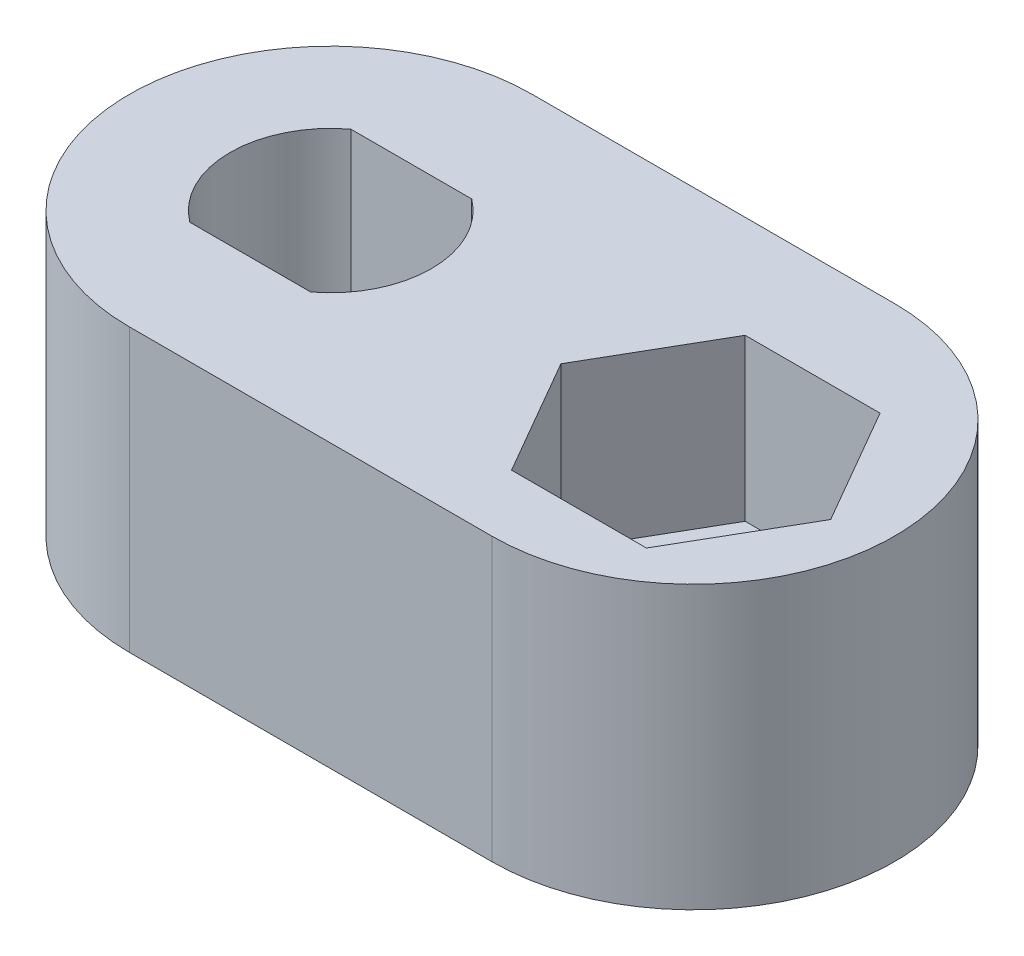
ISO-10303-21;
HEADER;
FILE_DESCRIPTION(('STEP AP214'),'2;1');
FILE_NAME('part.step','',(''),(''),'','','');
FILE_SCHEMA(('AUTOMOTIVE_DESIGN { 1 0 10303 214 1 1 1 1 }'));
ENDSEC;
DATA;
#1=APPLICATION_CONTEXT('core data for automotive mechanical design processes');
#2=APPLICATION_PROTOCOL_DEFINITION('international standard','automotive_design',2000,#1);
#3=PRODUCT_CONTEXT('',#1,'mechanical');
#4=PRODUCT('Part','Part','',(#3));
#5=PRODUCT_RELATED_PRODUCT_CATEGORY('part','',(#4));
#6=PRODUCT_DEFINITION_FORMATION('','',#4);
#7=PRODUCT_DEFINITION_CONTEXT('part definition',#1,'design');
#8=PRODUCT_DEFINITION('design','',#6,#7);
#9=PRODUCT_DEFINITION_SHAPE('','',#8);
#10=(LENGTH_UNIT() NAMED_UNIT(*) SI_UNIT(.MILLI.,.METRE.));
#11=(NAMED_UNIT(*) PLANE_ANGLE_UNIT() SI_UNIT($,.RADIAN.));
#12=(NAMED_UNIT(*) SI_UNIT($,.STERADIAN.) SOLID_ANGLE_UNIT());
#13=UNCERTAINTY_MEASURE_WITH_UNIT(LENGTH_MEASURE(1.E-05),#10,'distance_accuracy_value','');
#14=(GEOMETRIC_REPRESENTATION_CONTEXT(3) GLOBAL_UNCERTAINTY_ASSIGNED_CONTEXT((#13)) GLOBAL_UNIT_ASSIGNED_CONTEXT((#10,
#11,#12)) REPRESENTATION_CONTEXT('',''));
#15=CARTESIAN_POINT('',(0.,0.,0.));
#16=DIRECTION('',(0.,0.,1.));
#17=DIRECTION('',(1.,0.,0.));
#18=AXIS2_PLACEMENT_3D('',#15,#16,#17);
#19=CARTESIAN_POINT('',(5.,7.,0.436816997812618));
#20=DIRECTION('',(0.,1.,0.));
#21=DIRECTION('',(0.,0.,1.));
#22=AXIS2_PLACEMENT_3D('',#19,#20,#21);
#23=CYLINDRICAL_SURFACE('',#22,2.07500000000001);
#24=CARTESIAN_POINT('',(5.,0.,0.436816997812618));
#25=DIRECTION('',(0.,1.,0.));
#26=DIRECTION('',(0.,0.,1.));
#27=AXIS2_PLACEMENT_3D('',#24,#25,#26);
#28=CIRCLE('',#27,2.07500000000001);
#29=CARTESIAN_POINT('',(5.,0.,2.51181699781263));
#30=VERTEX_POINT('',#29);
#31=EDGE_CURVE('E193',#30,#30,#28,.T.);
#32=ORIENTED_EDGE('',*,*,#31,.F.);
#33=EDGE_LOOP('',(#32));
#34=FACE_BOUND('',#33,.T.);
#35=CARTESIAN_POINT('',(5.,3.,0.436816997812618));
#36=DIRECTION('',(0.,1.,0.));
#37=DIRECTION('',(0.,0.,1.));
#38=AXIS2_PLACEMENT_3D('',#35,#36,#37);
#39=CIRCLE('',#38,2.07500000000001);
#40=CARTESIAN_POINT('',(5.,3.,2.51181699781263));
#41=VERTEX_POINT('',#40);
#42=EDGE_CURVE('E39',#41,#41,#39,.F.);
#43=ORIENTED_EDGE('',*,*,#42,.F.);
#44=EDGE_LOOP('',(#43));
#45=FACE_BOUND('',#44,.T.);
#46=ADVANCED_FACE('F35',(#34,#45),#23,.F.);
#47=CARTESIAN_POINT('',(-4.5,7.,0.));
#48=DIRECTION('',(0.,-1.,0.));
#49=DIRECTION('',(0.,0.,-1.));
#50=AXIS2_PLACEMENT_3D('',#47,#48,#49);
#51=CYLINDRICAL_SURFACE('',#50,5.);
#52=CARTESIAN_POINT('',(-4.5,0.,0.));
#53=DIRECTION('',(0.,1.,0.));
#54=DIRECTION('',(0.,0.,1.));
#55=AXIS2_PLACEMENT_3D('',#52,#53,#54);
#56=CIRCLE('',#55,5.);
#57=CARTESIAN_POINT('',(-4.5,0.,-5.));
#58=VERTEX_POINT('',#57);
#59=CARTESIAN_POINT('',(-4.5,0.,5.));
#60=VERTEX_POINT('',#59);
#61=EDGE_CURVE('E223',#58,#60,#56,.T.);
#62=ORIENTED_EDGE('',*,*,#61,.T.);
#63=DIRECTION('',(0.,-1.,0.));
#64=VECTOR('',#63,1.);
#65=CARTESIAN_POINT('',(-4.5,7.,5.));
#66=LINE('',#65,#64);
#67=CARTESIAN_POINT('',(-4.5,7.,5.));
#68=VERTEX_POINT('',#67);
#69=EDGE_CURVE('E11',#68,#60,#66,.T.);
#70=ORIENTED_EDGE('',*,*,#69,.F.);
#71=CARTESIAN_POINT('',(-4.5,7.,0.));
#72=DIRECTION('',(0.,1.,0.));
#73=DIRECTION('',(0.,0.,1.));
#74=AXIS2_PLACEMENT_3D('',#71,#72,#73);
#75=CIRCLE('',#74,5.);
#76=CARTESIAN_POINT('',(-4.5,7.,-5.));
#77=VERTEX_POINT('',#76);
#78=EDGE_CURVE('E229',#77,#68,#75,.T.);
#79=ORIENTED_EDGE('',*,*,#78,.F.);
#80=DIRECTION('',(0.,-1.,0.));
#81=VECTOR('',#80,1.);
#82=CARTESIAN_POINT('',(-4.5,7.,-5.));
#83=LINE('',#82,#81);
#84=EDGE_CURVE('E239',#77,#58,#83,.T.);
#85=ORIENTED_EDGE('',*,*,#84,.T.);
#86=EDGE_LOOP('',(#62,#70,#79,#85));
#87=FACE_BOUND('',#86,.T.);
#88=ADVANCED_FACE('F37',(#87),#51,.T.);
#89=CARTESIAN_POINT('',(-4.5,7.,5.));
#90=DIRECTION('',(0.,0.,-1.));
#91=DIRECTION('',(-1.,0.,0.));
#92=AXIS2_PLACEMENT_3D('',#89,#90,#91);
#93=PLANE('',#92);
#94=DIRECTION('',(1.,0.,0.));
#95=VECTOR('',#94,1.);
#96=CARTESIAN_POINT('',(-4.5,0.,5.));
#97=LINE('',#96,#95);
#98=CARTESIAN_POINT('',(4.5,0.,5.));
#99=VERTEX_POINT('',#98);
#100=EDGE_CURVE('E242',#60,#99,#97,.T.);
#101=ORIENTED_EDGE('',*,*,#100,.T.);
#102=DIRECTION('',(0.,-1.,0.));
#103=VECTOR('',#102,1.);
#104=CARTESIAN_POINT('',(4.5,7.,5.));
#105=LINE('',#104,#103);
#106=CARTESIAN_POINT('',(4.5,7.,5.));
#107=VERTEX_POINT('',#106);
#108=EDGE_CURVE('E44',#107,#99,#105,.T.);
#109=ORIENTED_EDGE('',*,*,#108,.F.);
#110=DIRECTION('',(1.,0.,0.));
#111=VECTOR('',#110,1.);
#112=CARTESIAN_POINT('',(-4.5,7.,5.));
#113=LINE('',#112,#111);
#114=EDGE_CURVE('E232',#68,#107,#113,.T.);
#115=ORIENTED_EDGE('',*,*,#114,.F.);
#116=ORIENTED_EDGE('',*,*,#69,.T.);
#117=EDGE_LOOP('',(#101,#109,#115,#116));
#118=FACE_BOUND('',#117,.T.);
#119=ADVANCED_FACE('F296',(#118),#93,.F.);
#120=CARTESIAN_POINT('',(4.5,7.,0.));
#121=DIRECTION('',(0.,-1.,0.));
#122=DIRECTION('',(0.,0.,-1.));
#123=AXIS2_PLACEMENT_3D('',#120,#121,#122);
#124=CYLINDRICAL_SURFACE('',#123,5.);
#125=CARTESIAN_POINT('',(4.5,0.,0.));
#126=DIRECTION('',(0.,1.,0.));
#127=DIRECTION('',(0.,0.,1.));
#128=AXIS2_PLACEMENT_3D('',#125,#126,#127);
#129=CIRCLE('',#128,5.);
#130=CARTESIAN_POINT('',(4.5,0.,-5.));
#131=VERTEX_POINT('',#130);
#132=EDGE_CURVE('E244',#99,#131,#129,.T.);
#133=ORIENTED_EDGE('',*,*,#132,.T.);
#134=DIRECTION('',(0.,-1.,0.));
#135=VECTOR('',#134,1.);
#136=CARTESIAN_POINT('',(4.5,7.,-5.));
#137=LINE('',#136,#135);
#138=CARTESIAN_POINT('',(4.5,7.,-5.));
#139=VERTEX_POINT('',#138);
#140=EDGE_CURVE('E249',#139,#131,#137,.T.);
#141=ORIENTED_EDGE('',*,*,#140,.F.);
#142=CARTESIAN_POINT('',(4.5,7.,0.));
#143=DIRECTION('',(0.,1.,0.));
#144=DIRECTION('',(0.,0.,1.));
#145=AXIS2_PLACEMENT_3D('',#142,#143,#144);
#146=CIRCLE('',#145,5.);
#147=EDGE_CURVE('E235',#107,#139,#146,.T.);
#148=ORIENTED_EDGE('',*,*,#147,.F.);
#149=ORIENTED_EDGE('',*,*,#108,.T.);
#150=EDGE_LOOP('',(#133,#141,#148,#149));
#151=FACE_BOUND('',#150,.T.);
#152=ADVANCED_FACE('F301',(#151),#124,.T.);
#153=CARTESIAN_POINT('',(-4.5,7.,-5.));
#154=DIRECTION('',(0.,0.,1.));
#155=DIRECTION('',(1.,0.,0.));
#156=AXIS2_PLACEMENT_3D('',#153,#154,#155);
#157=PLANE('',#156);
#158=DIRECTION('',(-1.,0.,0.));
#159=VECTOR('',#158,1.);
#160=CARTESIAN_POINT('',(-4.5,0.,-5.));
#161=LINE('',#160,#159);
#162=EDGE_CURVE('E233',#131,#58,#161,.T.);
#163=ORIENTED_EDGE('',*,*,#162,.T.);
#164=ORIENTED_EDGE('',*,*,#84,.F.);
#165=DIRECTION('',(-1.,0.,0.));
#166=VECTOR('',#165,1.);
#167=CARTESIAN_POINT('',(-4.5,7.,-5.));
#168=LINE('',#167,#166);
#169=EDGE_CURVE('E237',#139,#77,#168,.T.);
#170=ORIENTED_EDGE('',*,*,#169,.F.);
#171=ORIENTED_EDGE('',*,*,#140,.T.);
#172=EDGE_LOOP('',(#163,#164,#170,#171));
#173=FACE_BOUND('',#172,.T.);
#174=ADVANCED_FACE('F285',(#173),#157,.F.);
#175=CARTESIAN_POINT('',(-4.5,7.,0.));
#176=DIRECTION('',(0.,1.,0.));
#177=DIRECTION('',(0.,0.,1.));
#178=AXIS2_PLACEMENT_3D('',#175,#176,#177);
#179=PLANE('',#178);
#180=DIRECTION('',(0.5,0.,-0.866025403784439));
#181=VECTOR('',#180,1.);
#182=CARTESIAN_POINT('',(6.67431578064445,7.,3.33681699781236));
#183=LINE('',#182,#181);
#184=CARTESIAN_POINT('',(6.67431578064445,7.,3.33681699781236));
#185=VERTEX_POINT('',#184);
#186=CARTESIAN_POINT('',(8.34863156129436,7.,0.436816997812368));
#187=VERTEX_POINT('',#186);
#188=EDGE_CURVE('E52',#185,#187,#183,.T.);
#189=ORIENTED_EDGE('',*,*,#188,.F.);
#190=DIRECTION('',(1.,0.,0.));
#191=VECTOR('',#190,1.);
#192=CARTESIAN_POINT('',(3.32568421934462,7.,3.33681699781236));
#193=LINE('',#192,#191);
#194=CARTESIAN_POINT('',(3.32568421934462,7.,3.33681699781236));
#195=VERTEX_POINT('',#194);
#196=EDGE_CURVE('E160',#195,#185,#193,.T.);
#197=ORIENTED_EDGE('',*,*,#196,.F.);
#198=DIRECTION('',(0.5,0.,0.866025403784439));
#199=VECTOR('',#198,1.);
#200=CARTESIAN_POINT('',(1.65136843869471,7.,0.436816997812369));
#201=LINE('',#200,#199);
#202=CARTESIAN_POINT('',(1.65136843869471,7.,0.436816997812369));
#203=VERTEX_POINT('',#202);
#204=EDGE_CURVE('E163',#203,#195,#201,.T.);
#205=ORIENTED_EDGE('',*,*,#204,.F.);
#206=DIRECTION('',(-0.5,0.,0.866025403784439));
#207=VECTOR('',#206,1.);
#208=CARTESIAN_POINT('',(3.32568421934462,7.,-2.46318300218763));
#209=LINE('',#208,#207);
#210=CARTESIAN_POINT('',(3.32568421934462,7.,-2.46318300218763));
#211=VERTEX_POINT('',#210);
#212=EDGE_CURVE('E179',#211,#203,#209,.T.);
#213=ORIENTED_EDGE('',*,*,#212,.F.);
#214=DIRECTION('',(-1.,0.,0.));
#215=VECTOR('',#214,1.);
#216=CARTESIAN_POINT('',(6.67431578064445,7.,-2.46318300218763));
#217=LINE('',#216,#215);
#218=CARTESIAN_POINT('',(6.67431578064445,7.,-2.46318300218763));
#219=VERTEX_POINT('',#218);
#220=EDGE_CURVE('E176',#219,#211,#217,.T.);
#221=ORIENTED_EDGE('',*,*,#220,.F.);
#222=DIRECTION('',(-0.5,0.,-0.866025403784439));
#223=VECTOR('',#222,1.);
#224=CARTESIAN_POINT('',(8.34863156129436,7.,0.436816997812367));
#225=LINE('',#224,#223);
#226=EDGE_CURVE('E174',#187,#219,#225,.T.);
#227=ORIENTED_EDGE('',*,*,#226,.F.);
#228=EDGE_LOOP('',(#189,#197,#205,#213,#221,#227));
#229=FACE_BOUND('',#228,.T.);
#230=CARTESIAN_POINT('',(-4.5,7.,0.));
#231=DIRECTION('',(0.,1.,0.));
#232=DIRECTION('',(0.,0.,1.));
#233=AXIS2_PLACEMENT_3D('',#230,#231,#232);
#234=CIRCLE('',#233,2.5);
#235=CARTESIAN_POINT('',(-6.,7.,-2.));
#236=VERTEX_POINT('',#235);
#237=CARTESIAN_POINT('',(-6.,7.,2.));
#238=VERTEX_POINT('',#237);
#239=EDGE_CURVE('E60',#236,#238,#234,.T.);
#240=ORIENTED_EDGE('',*,*,#239,.F.);
#241=DIRECTION('',(1.,0.,0.));
#242=VECTOR('',#241,1.);
#243=CARTESIAN_POINT('',(0.,7.,-2.));
#244=LINE('',#243,#242);
#245=CARTESIAN_POINT('',(-3.,7.,-2.));
#246=VERTEX_POINT('',#245);
#247=EDGE_CURVE('E207',#236,#246,#244,.T.);
#248=ORIENTED_EDGE('',*,*,#247,.T.);
#249=CARTESIAN_POINT('',(-3.,7.,2.));
#250=VERTEX_POINT('',#249);
#251=EDGE_CURVE('E216',#250,#246,#234,.T.);
#252=ORIENTED_EDGE('',*,*,#251,.F.);
#253=DIRECTION('',(1.,0.,0.));
#254=VECTOR('',#253,1.);
#255=CARTESIAN_POINT('',(0.,7.,2.));
#256=LINE('',#255,#254);
#257=EDGE_CURVE('E215',#238,#250,#256,.T.);
#258=ORIENTED_EDGE('',*,*,#257,.F.);
#259=EDGE_LOOP('',(#240,#248,#252,#258));
#260=FACE_BOUND('',#259,.T.);
#261=ORIENTED_EDGE('',*,*,#78,.T.);
#262=ORIENTED_EDGE('',*,*,#114,.T.);
#263=ORIENTED_EDGE('',*,*,#147,.T.);
#264=ORIENTED_EDGE('',*,*,#169,.T.);
#265=EDGE_LOOP('',(#261,#262,#263,#264));
#266=FACE_BOUND('',#265,.T.);
#267=ADVANCED_FACE('F281',(#229,#260,#266),#179,.T.);
#268=CARTESIAN_POINT('',(-4.5,0.,0.));
#269=DIRECTION('',(0.,1.,0.));
#270=DIRECTION('',(0.,0.,1.));
#271=AXIS2_PLACEMENT_3D('',#268,#269,#270);
#272=PLANE('',#271);
#273=ORIENTED_EDGE('',*,*,#31,.T.);
#274=EDGE_LOOP('',(#273));
#275=FACE_BOUND('',#274,.T.);
#276=CARTESIAN_POINT('',(-4.5,0.,0.));
#277=DIRECTION('',(0.,-1.,0.));
#278=DIRECTION('',(0.,0.,-1.));
#279=AXIS2_PLACEMENT_3D('',#276,#277,#278);
#280=CIRCLE('',#279,3.36);
#281=CARTESIAN_POINT('',(-4.5,0.,-3.36));
#282=VERTEX_POINT('',#281);
#283=EDGE_CURVE('E196',#282,#282,#280,.T.);
#284=ORIENTED_EDGE('',*,*,#283,.F.);
#285=EDGE_LOOP('',(#284));
#286=FACE_BOUND('',#285,.T.);
#287=ORIENTED_EDGE('',*,*,#61,.F.);
#288=ORIENTED_EDGE('',*,*,#162,.F.);
#289=ORIENTED_EDGE('',*,*,#132,.F.);
#290=ORIENTED_EDGE('',*,*,#100,.F.);
#291=EDGE_LOOP('',(#287,#288,#289,#290));
#292=FACE_BOUND('',#291,.T.);
#293=ADVANCED_FACE('F284',(#275,#286,#292),#272,.F.);
#294=CARTESIAN_POINT('',(-4.5,3.,0.));
#295=DIRECTION('',(0.,1.,0.));
#296=DIRECTION('',(0.,0.,1.));
#297=AXIS2_PLACEMENT_3D('',#294,#295,#296);
#298=CYLINDRICAL_SURFACE('',#297,2.5);
#299=ORIENTED_EDGE('',*,*,#239,.T.);
#300=DIRECTION('',(0.,1.,0.));
#301=VECTOR('',#300,1.);
#302=CARTESIAN_POINT('',(-6.,3.,2.));
#303=LINE('',#302,#301);
#304=CARTESIAN_POINT('',(-6.,3.,2.));
#305=VERTEX_POINT('',#304);
#306=EDGE_CURVE('E213',#305,#238,#303,.T.);
#307=ORIENTED_EDGE('',*,*,#306,.F.);
#308=CARTESIAN_POINT('',(-4.5,3.,0.));
#309=DIRECTION('',(0.,1.,0.));
#310=DIRECTION('',(0.,0.,1.));
#311=AXIS2_PLACEMENT_3D('',#308,#309,#310);
#312=CIRCLE('',#311,2.5);
#313=CARTESIAN_POINT('',(-6.,3.,-2.));
#314=VERTEX_POINT('',#313);
#315=EDGE_CURVE('E203',#314,#305,#312,.T.);
#316=ORIENTED_EDGE('',*,*,#315,.F.);
#317=DIRECTION('',(0.,1.,0.));
#318=VECTOR('',#317,1.);
#319=CARTESIAN_POINT('',(-6.,3.,-2.));
#320=LINE('',#319,#318);
#321=EDGE_CURVE('E221',#314,#236,#320,.T.);
#322=ORIENTED_EDGE('',*,*,#321,.T.);
#323=EDGE_LOOP('',(#299,#307,#316,#322));
#324=FACE_BOUND('',#323,.T.);
#325=ADVANCED_FACE('F268',(#324),#298,.F.);
#326=CARTESIAN_POINT('',(0.,3.,-2.));
#327=DIRECTION('',(0.,0.,1.));
#328=DIRECTION('',(1.,0.,0.));
#329=AXIS2_PLACEMENT_3D('',#326,#327,#328);
#330=PLANE('',#329);
#331=ORIENTED_EDGE('',*,*,#247,.F.);
#332=ORIENTED_EDGE('',*,*,#321,.F.);
#333=DIRECTION('',(1.,0.,0.));
#334=VECTOR('',#333,1.);
#335=CARTESIAN_POINT('',(0.,3.,-2.));
#336=LINE('',#335,#334);
#337=CARTESIAN_POINT('',(-3.,3.,-2.));
#338=VERTEX_POINT('',#337);
#339=EDGE_CURVE('E211',#314,#338,#336,.T.);
#340=ORIENTED_EDGE('',*,*,#339,.T.);
#341=DIRECTION('',(0.,1.,0.));
#342=VECTOR('',#341,1.);
#343=CARTESIAN_POINT('',(-3.,3.,-2.));
#344=LINE('',#343,#342);
#345=EDGE_CURVE('E224',#338,#246,#344,.T.);
#346=ORIENTED_EDGE('',*,*,#345,.T.);
#347=EDGE_LOOP('',(#331,#332,#340,#346));
#348=FACE_BOUND('',#347,.T.);
#349=ADVANCED_FACE('F279',(#348),#330,.T.);
#350=ORIENTED_EDGE('',*,*,#251,.T.);
#351=ORIENTED_EDGE('',*,*,#345,.F.);
#352=CARTESIAN_POINT('',(-3.,3.,2.));
#353=VERTEX_POINT('',#352);
#354=EDGE_CURVE('E208',#353,#338,#312,.T.);
#355=ORIENTED_EDGE('',*,*,#354,.F.);
#356=DIRECTION('',(0.,1.,0.));
#357=VECTOR('',#356,1.);
#358=CARTESIAN_POINT('',(-3.,3.,2.));
#359=LINE('',#358,#357);
#360=EDGE_CURVE('E226',#353,#250,#359,.T.);
#361=ORIENTED_EDGE('',*,*,#360,.T.);
#362=EDGE_LOOP('',(#350,#351,#355,#361));
#363=FACE_BOUND('',#362,.T.);
#364=ADVANCED_FACE('F277',(#363),#298,.F.);
#365=CARTESIAN_POINT('',(0.,3.,2.));
#366=DIRECTION('',(0.,0.,1.));
#367=DIRECTION('',(1.,0.,0.));
#368=AXIS2_PLACEMENT_3D('',#365,#366,#367);
#369=PLANE('',#368);
#370=ORIENTED_EDGE('',*,*,#257,.T.);
#371=ORIENTED_EDGE('',*,*,#360,.F.);
#372=DIRECTION('',(1.,0.,0.));
#373=VECTOR('',#372,1.);
#374=CARTESIAN_POINT('',(0.,3.,2.));
#375=LINE('',#374,#373);
#376=EDGE_CURVE('E206',#305,#353,#375,.T.);
#377=ORIENTED_EDGE('',*,*,#376,.F.);
#378=ORIENTED_EDGE('',*,*,#306,.T.);
#379=EDGE_LOOP('',(#370,#371,#377,#378));
#380=FACE_BOUND('',#379,.T.);
#381=ADVANCED_FACE('F262',(#380),#369,.F.);
#382=CARTESIAN_POINT('',(0.,3.,0.));
#383=DIRECTION('',(0.,1.,0.));
#384=DIRECTION('',(0.,0.,1.));
#385=AXIS2_PLACEMENT_3D('',#382,#383,#384);
#386=PLANE('',#385);
#387=CARTESIAN_POINT('',(-4.5,3.,0.));
#388=DIRECTION('',(0.,1.,0.));
#389=DIRECTION('',(0.,0.,1.));
#390=AXIS2_PLACEMENT_3D('',#387,#388,#389);
#391=CIRCLE('',#390,1.7);
#392=CARTESIAN_POINT('',(-4.5,3.,1.7));
#393=VERTEX_POINT('',#392);
#394=EDGE_CURVE('E202',#393,#393,#391,.T.);
#395=ORIENTED_EDGE('',*,*,#394,.F.);
#396=EDGE_LOOP('',(#395));
#397=FACE_BOUND('',#396,.T.);
#398=ORIENTED_EDGE('',*,*,#315,.T.);
#399=ORIENTED_EDGE('',*,*,#376,.T.);
#400=ORIENTED_EDGE('',*,*,#354,.T.);
#401=ORIENTED_EDGE('',*,*,#339,.F.);
#402=EDGE_LOOP('',(#398,#399,#400,#401));
#403=FACE_BOUND('',#402,.T.);
#404=ADVANCED_FACE('F259',(#397,#403),#386,.T.);
#405=CARTESIAN_POINT('',(-4.5,0.,0.));
#406=DIRECTION('',(0.,-1.,0.));
#407=DIRECTION('',(0.,0.,-1.));
#408=AXIS2_PLACEMENT_3D('',#405,#406,#407);
#409=CYLINDRICAL_SURFACE('',#408,1.7);
#410=ORIENTED_EDGE('',*,*,#394,.T.);
#411=EDGE_LOOP('',(#410));
#412=FACE_BOUND('',#411,.T.);
#413=CARTESIAN_POINT('',(-4.5,1.66,0.));
#414=DIRECTION('',(0.,-1.,0.));
#415=DIRECTION('',(0.,0.,-1.));
#416=AXIS2_PLACEMENT_3D('',#413,#414,#415);
#417=CIRCLE('',#416,1.7);
#418=CARTESIAN_POINT('',(-4.5,1.66,-1.7));
#419=VERTEX_POINT('',#418);
#420=EDGE_CURVE('E199',#419,#419,#417,.T.);
#421=ORIENTED_EDGE('',*,*,#420,.T.);
#422=EDGE_LOOP('',(#421));
#423=FACE_BOUND('',#422,.T.);
#424=ADVANCED_FACE('F256',(#412,#423),#409,.F.);
#425=CARTESIAN_POINT('',(-4.5,0.,0.));
#426=DIRECTION('',(0.,-1.,0.));
#427=DIRECTION('',(0.,0.,-1.));
#428=AXIS2_PLACEMENT_3D('',#425,#426,#427);
#429=CONICAL_SURFACE('',#428,3.36,0.785398163397448);
#430=ORIENTED_EDGE('',*,*,#420,.F.);
#431=EDGE_LOOP('',(#430));
#432=FACE_BOUND('',#431,.T.);
#433=ORIENTED_EDGE('',*,*,#283,.T.);
#434=EDGE_LOOP('',(#433));
#435=FACE_BOUND('',#434,.T.);
#436=ADVANCED_FACE('F325',(#432,#435),#429,.F.);
#437=CARTESIAN_POINT('',(0.,3.,0.));
#438=DIRECTION('',(0.,1.,0.));
#439=DIRECTION('',(0.,0.,1.));
#440=AXIS2_PLACEMENT_3D('',#437,#438,#439);
#441=PLANE('',#440);
#442=DIRECTION('',(0.5,0.,-0.866025403784439));
#443=VECTOR('',#442,1.);
#444=CARTESIAN_POINT('',(6.67431578064445,3.,3.33681699781236));
#445=LINE('',#444,#443);
#446=CARTESIAN_POINT('',(6.67431578064445,3.,3.33681699781236));
#447=VERTEX_POINT('',#446);
#448=CARTESIAN_POINT('',(8.34863156129436,3.,0.436816997812367));
#449=VERTEX_POINT('',#448);
#450=EDGE_CURVE('E140',#447,#449,#445,.T.);
#451=ORIENTED_EDGE('',*,*,#450,.T.);
#452=DIRECTION('',(-0.5,0.,-0.866025403784439));
#453=VECTOR('',#452,1.);
#454=CARTESIAN_POINT('',(8.34863156129436,3.,0.436816997812367));
#455=LINE('',#454,#453);
#456=CARTESIAN_POINT('',(6.67431578064445,3.,-2.46318300218763));
#457=VERTEX_POINT('',#456);
#458=EDGE_CURVE('E149',#449,#457,#455,.T.);
#459=ORIENTED_EDGE('',*,*,#458,.T.);
#460=DIRECTION('',(-1.,0.,0.));
#461=VECTOR('',#460,1.);
#462=CARTESIAN_POINT('',(6.67431578064445,3.,-2.46318300218763));
#463=LINE('',#462,#461);
#464=CARTESIAN_POINT('',(3.32568421934462,3.,-2.46318300218763));
#465=VERTEX_POINT('',#464);
#466=EDGE_CURVE('E154',#457,#465,#463,.T.);
#467=ORIENTED_EDGE('',*,*,#466,.T.);
#468=DIRECTION('',(-0.5,0.,0.866025403784439));
#469=VECTOR('',#468,1.);
#470=CARTESIAN_POINT('',(3.32568421934462,3.,-2.46318300218763));
#471=LINE('',#470,#469);
#472=CARTESIAN_POINT('',(1.65136843869471,3.,0.436816997812369));
#473=VERTEX_POINT('',#472);
#474=EDGE_CURVE('E167',#465,#473,#471,.T.);
#475=ORIENTED_EDGE('',*,*,#474,.T.);
#476=DIRECTION('',(0.5,0.,0.866025403784439));
#477=VECTOR('',#476,1.);
#478=CARTESIAN_POINT('',(1.65136843869471,3.,0.436816997812369));
#479=LINE('',#478,#477);
#480=CARTESIAN_POINT('',(3.32568421934462,3.,3.33681699781236));
#481=VERTEX_POINT('',#480);
#482=EDGE_CURVE('E170',#473,#481,#479,.T.);
#483=ORIENTED_EDGE('',*,*,#482,.T.);
#484=DIRECTION('',(1.,0.,0.));
#485=VECTOR('',#484,1.);
#486=CARTESIAN_POINT('',(3.32568421934462,3.,3.33681699781236));
#487=LINE('',#486,#485);
#488=EDGE_CURVE('E146',#481,#447,#487,.T.);
#489=ORIENTED_EDGE('',*,*,#488,.T.);
#490=EDGE_LOOP('',(#451,#459,#467,#475,#483,#489));
#491=FACE_BOUND('',#490,.T.);
#492=ORIENTED_EDGE('',*,*,#42,.T.);
#493=EDGE_LOOP('',(#492));
#494=FACE_BOUND('',#493,.T.);
#495=ADVANCED_FACE('F156',(#491,#494),#441,.T.);
#496=CARTESIAN_POINT('',(6.67431578064445,3.,3.33681699781236));
#497=DIRECTION('',(0.866025403784439,0.,0.5));
#498=DIRECTION('',(0.5,0.,-0.866025403784439));
#499=AXIS2_PLACEMENT_3D('',#496,#497,#498);
#500=PLANE('',#499);
#501=ORIENTED_EDGE('',*,*,#188,.T.);
#502=DIRECTION('',(0.,1.,0.));
#503=VECTOR('',#502,1.);
#504=CARTESIAN_POINT('',(8.34863156129436,3.,0.436816997812367));
#505=LINE('',#504,#503);
#506=EDGE_CURVE('E136',#449,#187,#505,.T.);
#507=ORIENTED_EDGE('',*,*,#506,.F.);
#508=ORIENTED_EDGE('',*,*,#450,.F.);
#509=DIRECTION('',(0.,1.,0.));
#510=VECTOR('',#509,1.);
#511=CARTESIAN_POINT('',(6.67431578064445,3.,3.33681699781236));
#512=LINE('',#511,#510);
#513=EDGE_CURVE('E184',#447,#185,#512,.T.);
#514=ORIENTED_EDGE('',*,*,#513,.T.);
#515=EDGE_LOOP('',(#501,#507,#508,#514));
#516=FACE_BOUND('',#515,.T.);
#517=ADVANCED_FACE('F138',(#516),#500,.F.);
#518=CARTESIAN_POINT('',(3.32568421934462,3.,3.33681699781236));
#519=DIRECTION('',(0.,0.,1.));
#520=DIRECTION('',(1.,0.,0.));
#521=AXIS2_PLACEMENT_3D('',#518,#519,#520);
#522=PLANE('',#521);
#523=ORIENTED_EDGE('',*,*,#196,.T.);
#524=ORIENTED_EDGE('',*,*,#513,.F.);
#525=ORIENTED_EDGE('',*,*,#488,.F.);
#526=DIRECTION('',(0.,1.,0.));
#527=VECTOR('',#526,1.);
#528=CARTESIAN_POINT('',(3.32568421934462,3.,3.33681699781236));
#529=LINE('',#528,#527);
#530=EDGE_CURVE('E186',#481,#195,#529,.T.);
#531=ORIENTED_EDGE('',*,*,#530,.T.);
#532=EDGE_LOOP('',(#523,#524,#525,#531));
#533=FACE_BOUND('',#532,.T.);
#534=ADVANCED_FACE('F364',(#533),#522,.F.);
#535=CARTESIAN_POINT('',(1.65136843869471,3.,0.436816997812369));
#536=DIRECTION('',(-0.866025403784439,0.,0.5));
#537=DIRECTION('',(0.5,0.,0.866025403784439));
#538=AXIS2_PLACEMENT_3D('',#535,#536,#537);
#539=PLANE('',#538);
#540=ORIENTED_EDGE('',*,*,#204,.T.);
#541=ORIENTED_EDGE('',*,*,#530,.F.);
#542=ORIENTED_EDGE('',*,*,#482,.F.);
#543=DIRECTION('',(0.,1.,0.));
#544=VECTOR('',#543,1.);
#545=CARTESIAN_POINT('',(1.65136843869471,3.,0.436816997812369));
#546=LINE('',#545,#544);
#547=EDGE_CURVE('E188',#473,#203,#546,.T.);
#548=ORIENTED_EDGE('',*,*,#547,.T.);
#549=EDGE_LOOP('',(#540,#541,#542,#548));
#550=FACE_BOUND('',#549,.T.);
#551=ADVANCED_FACE('F370',(#550),#539,.F.);
#552=CARTESIAN_POINT('',(3.32568421934462,3.,-2.46318300218763));
#553=DIRECTION('',(-0.866025403784439,0.,-0.5));
#554=DIRECTION('',(-0.5,0.,0.866025403784439));
#555=AXIS2_PLACEMENT_3D('',#552,#553,#554);
#556=PLANE('',#555);
#557=ORIENTED_EDGE('',*,*,#212,.T.);
#558=ORIENTED_EDGE('',*,*,#547,.F.);
#559=ORIENTED_EDGE('',*,*,#474,.F.);
#560=DIRECTION('',(0.,1.,0.));
#561=VECTOR('',#560,1.);
#562=CARTESIAN_POINT('',(3.32568421934462,3.,-2.46318300218763));
#563=LINE('',#562,#561);
#564=EDGE_CURVE('E190',#465,#211,#563,.T.);
#565=ORIENTED_EDGE('',*,*,#564,.T.);
#566=EDGE_LOOP('',(#557,#558,#559,#565));
#567=FACE_BOUND('',#566,.T.);
#568=ADVANCED_FACE('F378',(#567),#556,.F.);
#569=CARTESIAN_POINT('',(6.67431578064445,3.,-2.46318300218763));
#570=DIRECTION('',(0.,0.,-1.));
#571=DIRECTION('',(-1.,0.,0.));
#572=AXIS2_PLACEMENT_3D('',#569,#570,#571);
#573=PLANE('',#572);
#574=ORIENTED_EDGE('',*,*,#220,.T.);
#575=ORIENTED_EDGE('',*,*,#564,.F.);
#576=ORIENTED_EDGE('',*,*,#466,.F.);
#577=DIRECTION('',(0.,1.,0.));
#578=VECTOR('',#577,1.);
#579=CARTESIAN_POINT('',(6.67431578064445,3.,-2.46318300218763));
#580=LINE('',#579,#578);
#581=EDGE_CURVE('E145',#457,#219,#580,.T.);
#582=ORIENTED_EDGE('',*,*,#581,.T.);
#583=EDGE_LOOP('',(#574,#575,#576,#582));
#584=FACE_BOUND('',#583,.T.);
#585=ADVANCED_FACE('F386',(#584),#573,.F.);
#586=CARTESIAN_POINT('',(8.34863156129436,3.,0.436816997812367));
#587=DIRECTION('',(0.866025403784439,0.,-0.5));
#588=DIRECTION('',(-0.5,0.,-0.866025403784439));
#589=AXIS2_PLACEMENT_3D('',#586,#587,#588);
#590=PLANE('',#589);
#591=ORIENTED_EDGE('',*,*,#226,.T.);
#592=ORIENTED_EDGE('',*,*,#581,.F.);
#593=ORIENTED_EDGE('',*,*,#458,.F.);
#594=ORIENTED_EDGE('',*,*,#506,.T.);
#595=EDGE_LOOP('',(#591,#592,#593,#594));
#596=FACE_BOUND('',#595,.T.);
#597=ADVANCED_FACE('F150',(#596),#590,.F.);
#598=CLOSED_SHELL('',(#46,#88,#119,#152,#174,#267,#293,#325,#349,#364,#381,#404,#424,#436,#495,
#517,#534,#551,#568,#585,#597));
#599=MANIFOLD_SOLID_BREP('B2',#598);
#600=ADVANCED_BREP_SHAPE_REPRESENTATION('',(#18,#599),#14);
#601=SHAPE_DEFINITION_REPRESENTATION(#9,#600);
ENDSEC;
END-ISO-10303-21;
